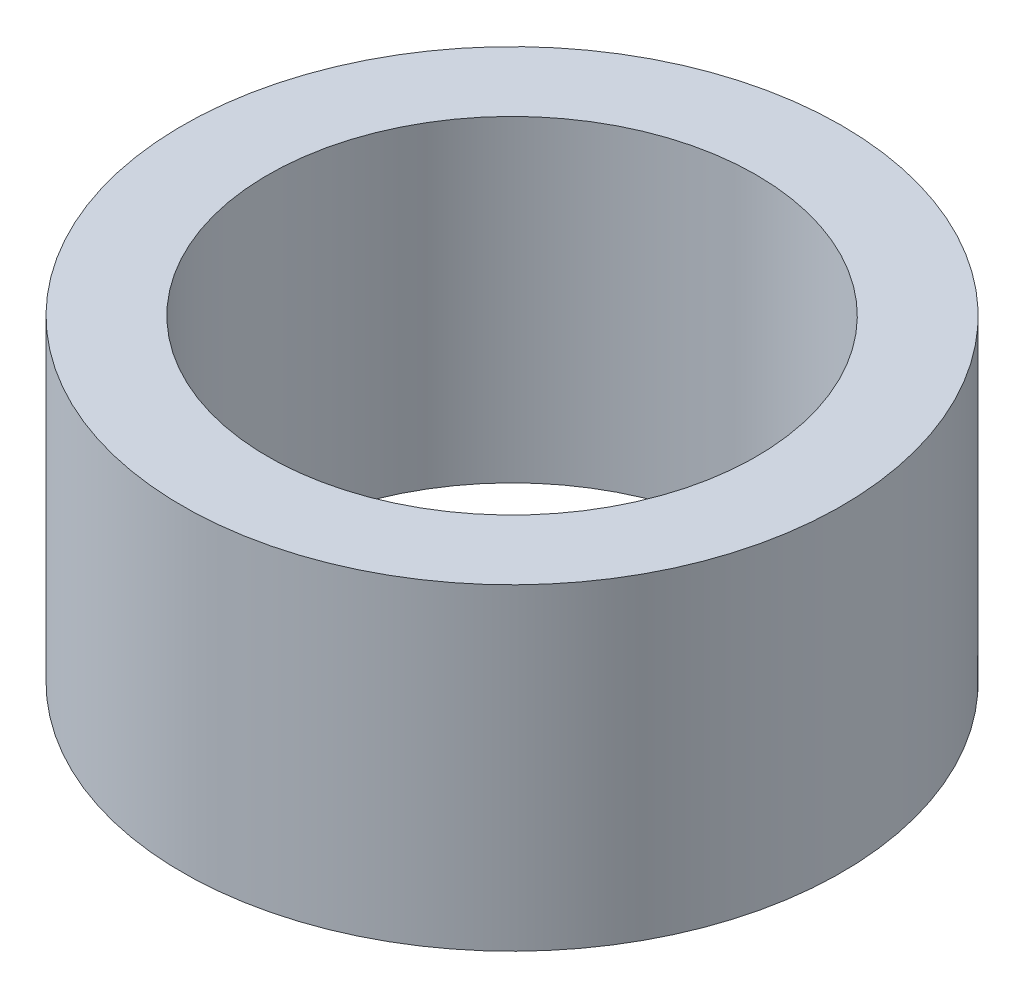
ISO-10303-21;
HEADER;
FILE_DESCRIPTION(('STEP AP214'),'2;1');
FILE_NAME('part.step','',(''),(''),'','','');
FILE_SCHEMA(('AUTOMOTIVE_DESIGN { 1 0 10303 214 1 1 1 1 }'));
ENDSEC;
DATA;
#1=APPLICATION_CONTEXT('core data for automotive mechanical design processes');
#2=APPLICATION_PROTOCOL_DEFINITION('international standard','automotive_design',2000,#1);
#3=PRODUCT_CONTEXT('',#1,'mechanical');
#4=PRODUCT('Part','Part','',(#3));
#5=PRODUCT_RELATED_PRODUCT_CATEGORY('part','',(#4));
#6=PRODUCT_DEFINITION_FORMATION('','',#4);
#7=PRODUCT_DEFINITION_CONTEXT('part definition',#1,'design');
#8=PRODUCT_DEFINITION('design','',#6,#7);
#9=PRODUCT_DEFINITION_SHAPE('','',#8);
#10=(LENGTH_UNIT() NAMED_UNIT(*) SI_UNIT(.MILLI.,.METRE.));
#11=(NAMED_UNIT(*) PLANE_ANGLE_UNIT() SI_UNIT($,.RADIAN.));
#12=(NAMED_UNIT(*) SI_UNIT($,.STERADIAN.) SOLID_ANGLE_UNIT());
#13=UNCERTAINTY_MEASURE_WITH_UNIT(LENGTH_MEASURE(1.E-05),#10,'distance_accuracy_value','');
#14=(GEOMETRIC_REPRESENTATION_CONTEXT(3) GLOBAL_UNCERTAINTY_ASSIGNED_CONTEXT((#13)) GLOBAL_UNIT_ASSIGNED_CONTEXT((#10,
#11,#12)) REPRESENTATION_CONTEXT('',''));
#15=CARTESIAN_POINT('',(0.,0.,0.));
#16=DIRECTION('',(0.,0.,1.));
#17=DIRECTION('',(1.,0.,0.));
#18=AXIS2_PLACEMENT_3D('',#15,#16,#17);
#19=CARTESIAN_POINT('',(0.,6.5,0.));
#20=DIRECTION('',(0.,1.,0.));
#21=DIRECTION('',(0.,0.,1.));
#22=AXIS2_PLACEMENT_3D('',#19,#20,#21);
#23=PLANE('',#22);
#24=CARTESIAN_POINT('',(0.,6.5,0.));
#25=DIRECTION('',(0.,1.,0.));
#26=DIRECTION('',(0.,0.,1.));
#27=AXIS2_PLACEMENT_3D('',#24,#25,#26);
#28=CIRCLE('',#27,6.75);
#29=CARTESIAN_POINT('',(0.,6.5,-6.75));
#30=VERTEX_POINT('',#29);
#31=EDGE_CURVE('E10',#30,#30,#28,.T.);
#32=ORIENTED_EDGE('',*,*,#31,.T.);
#33=EDGE_LOOP('',(#32));
#34=FACE_BOUND('',#33,.T.);
#35=CARTESIAN_POINT('',(0.,6.5,0.));
#36=DIRECTION('',(0.,1.,0.));
#37=DIRECTION('',(0.,0.,1.));
#38=AXIS2_PLACEMENT_3D('',#35,#36,#37);
#39=CIRCLE('',#38,5.);
#40=CARTESIAN_POINT('',(0.,6.5,-5.));
#41=VERTEX_POINT('',#40);
#42=EDGE_CURVE('E46',#41,#41,#39,.T.);
#43=ORIENTED_EDGE('',*,*,#42,.F.);
#44=EDGE_LOOP('',(#43));
#45=FACE_BOUND('',#44,.T.);
#46=ADVANCED_FACE('F35',(#34,#45),#23,.T.);
#47=CARTESIAN_POINT('',(0.,0.,0.));
#48=DIRECTION('',(0.,1.,0.));
#49=DIRECTION('',(0.,0.,1.));
#50=AXIS2_PLACEMENT_3D('',#47,#48,#49);
#51=PLANE('',#50);
#52=CARTESIAN_POINT('',(0.,0.,0.));
#53=DIRECTION('',(0.,1.,0.));
#54=DIRECTION('',(0.,0.,1.));
#55=AXIS2_PLACEMENT_3D('',#52,#53,#54);
#56=CIRCLE('',#55,6.75);
#57=CARTESIAN_POINT('',(0.,0.,-6.75));
#58=VERTEX_POINT('',#57);
#59=EDGE_CURVE('E39',#58,#58,#56,.T.);
#60=ORIENTED_EDGE('',*,*,#59,.F.);
#61=EDGE_LOOP('',(#60));
#62=FACE_BOUND('',#61,.T.);
#63=CARTESIAN_POINT('',(0.,0.,0.));
#64=DIRECTION('',(0.,1.,0.));
#65=DIRECTION('',(0.,0.,1.));
#66=AXIS2_PLACEMENT_3D('',#63,#64,#65);
#67=CIRCLE('',#66,5.);
#68=CARTESIAN_POINT('',(0.,0.,-5.));
#69=VERTEX_POINT('',#68);
#70=EDGE_CURVE('E48',#69,#69,#67,.T.);
#71=ORIENTED_EDGE('',*,*,#70,.T.);
#72=EDGE_LOOP('',(#71));
#73=FACE_BOUND('',#72,.T.);
#74=ADVANCED_FACE('F58',(#62,#73),#51,.F.);
#75=CARTESIAN_POINT('',(0.,6.5,0.));
#76=DIRECTION('',(0.,-1.,0.));
#77=DIRECTION('',(0.,0.,-1.));
#78=AXIS2_PLACEMENT_3D('',#75,#76,#77);
#79=CYLINDRICAL_SURFACE('',#78,6.75);
#80=CARTESIAN_POINT('',(0.,6.5,-6.75));
#81=CARTESIAN_POINT('',(0.,6.43229166666667,-6.75));
#82=CARTESIAN_POINT('',(0.,6.36458333333333,-6.75));
#83=CARTESIAN_POINT('',(0.,6.22916666666667,-6.75));
#84=CARTESIAN_POINT('',(0.,6.16145833333333,-6.75));
#85=CARTESIAN_POINT('',(0.,6.02604166666667,-6.75));
#86=CARTESIAN_POINT('',(0.,5.95833333333333,-6.75));
#87=CARTESIAN_POINT('',(0.,5.82291666666667,-6.75));
#88=CARTESIAN_POINT('',(0.,5.75520833333333,-6.75));
#89=CARTESIAN_POINT('',(0.,5.61979166666667,-6.75));
#90=CARTESIAN_POINT('',(0.,5.55208333333333,-6.75));
#91=CARTESIAN_POINT('',(0.,5.41666666666667,-6.75));
#92=CARTESIAN_POINT('',(0.,5.34895833333333,-6.75));
#93=CARTESIAN_POINT('',(0.,5.21354166666667,-6.75));
#94=CARTESIAN_POINT('',(0.,5.14583333333333,-6.75));
#95=CARTESIAN_POINT('',(0.,5.01041666666667,-6.75));
#96=CARTESIAN_POINT('',(0.,4.94270833333333,-6.75));
#97=CARTESIAN_POINT('',(0.,4.80729166666667,-6.75));
#98=CARTESIAN_POINT('',(0.,4.73958333333333,-6.75));
#99=CARTESIAN_POINT('',(0.,4.60416666666667,-6.75));
#100=CARTESIAN_POINT('',(0.,4.53645833333333,-6.75));
#101=CARTESIAN_POINT('',(0.,4.40104166666667,-6.75));
#102=CARTESIAN_POINT('',(0.,4.33333333333333,-6.75));
#103=CARTESIAN_POINT('',(0.,4.19791666666667,-6.75));
#104=CARTESIAN_POINT('',(0.,4.13020833333333,-6.75));
#105=CARTESIAN_POINT('',(0.,3.99479166666667,-6.75));
#106=CARTESIAN_POINT('',(0.,3.92708333333333,-6.75));
#107=CARTESIAN_POINT('',(0.,3.79166666666667,-6.75));
#108=CARTESIAN_POINT('',(0.,3.72395833333333,-6.75));
#109=CARTESIAN_POINT('',(0.,3.58854166666667,-6.75));
#110=CARTESIAN_POINT('',(0.,3.52083333333333,-6.75));
#111=CARTESIAN_POINT('',(0.,3.38541666666667,-6.75));
#112=CARTESIAN_POINT('',(0.,3.31770833333333,-6.75));
#113=CARTESIAN_POINT('',(0.,3.18229166666667,-6.75));
#114=CARTESIAN_POINT('',(0.,3.11458333333333,-6.75));
#115=CARTESIAN_POINT('',(0.,2.97916666666667,-6.75));
#116=CARTESIAN_POINT('',(0.,2.91145833333333,-6.75));
#117=CARTESIAN_POINT('',(0.,2.77604166666667,-6.75));
#118=CARTESIAN_POINT('',(0.,2.70833333333333,-6.75));
#119=CARTESIAN_POINT('',(0.,2.57291666666667,-6.75));
#120=CARTESIAN_POINT('',(0.,2.50520833333333,-6.75));
#121=CARTESIAN_POINT('',(0.,2.36979166666667,-6.75));
#122=CARTESIAN_POINT('',(0.,2.30208333333333,-6.75));
#123=CARTESIAN_POINT('',(0.,2.16666666666667,-6.75));
#124=CARTESIAN_POINT('',(0.,2.09895833333333,-6.75));
#125=CARTESIAN_POINT('',(0.,1.96354166666667,-6.75));
#126=CARTESIAN_POINT('',(0.,1.89583333333333,-6.75));
#127=CARTESIAN_POINT('',(0.,1.76041666666667,-6.75));
#128=CARTESIAN_POINT('',(0.,1.69270833333333,-6.75));
#129=CARTESIAN_POINT('',(0.,1.55729166666667,-6.75));
#130=CARTESIAN_POINT('',(0.,1.48958333333333,-6.75));
#131=CARTESIAN_POINT('',(0.,1.35416666666667,-6.75));
#132=CARTESIAN_POINT('',(0.,1.28645833333333,-6.75));
#133=CARTESIAN_POINT('',(0.,1.15104166666667,-6.75));
#134=CARTESIAN_POINT('',(0.,1.08333333333333,-6.75));
#135=CARTESIAN_POINT('',(0.,0.947916666666667,-6.75));
#136=CARTESIAN_POINT('',(0.,0.880208333333333,-6.75));
#137=CARTESIAN_POINT('',(0.,0.744791666666667,-6.75));
#138=CARTESIAN_POINT('',(0.,0.677083333333333,-6.75));
#139=CARTESIAN_POINT('',(0.,0.541666666666667,-6.75));
#140=CARTESIAN_POINT('',(0.,0.473958333333333,-6.75));
#141=CARTESIAN_POINT('',(0.,0.338541666666667,-6.75));
#142=CARTESIAN_POINT('',(0.,0.270833333333334,-6.75));
#143=CARTESIAN_POINT('',(0.,0.135416666666667,-6.75));
#144=CARTESIAN_POINT('',(0.,0.0677083333333334,-6.75));
#145=CARTESIAN_POINT('',(0.,0.,-6.75));
#146=B_SPLINE_CURVE_WITH_KNOTS('',3,(#80,#81,#82,#83,#84,#85,#86,#87,#88,#89,#90,#91,#92,#93,
#94,#95,#96,#97,#98,#99,#100,#101,#102,#103,#104,#105,#106,#107,#108,#109,#110,#111,#112,#113,
#114,#115,#116,#117,#118,#119,#120,#121,#122,#123,#124,#125,#126,#127,#128,#129,#130,#131,#132,
#133,#134,#135,#136,#137,#138,#139,#140,#141,#142,#143,#144,#145),.UNSPECIFIED.,.F.,.F.,(4,2,2,
2,2,2,2,2,2,2,2,2,2,2,2,2,2,2,2,2,2,2,2,2,2,2,2,2,2,2,2,2,4),(0.,0.203124999999999,0.40625,
0.609375,0.812499999999999,1.015625,1.21875,1.421875,1.625,1.828125,2.03125,2.234375,2.4375,
2.640625,2.84375,3.046875,3.25,3.453125,3.65625,3.859375,4.0625,4.265625,4.46875,4.671875,4.875,
5.078125,5.28125,5.484375,5.6875,5.890625,6.09375,6.296875,6.5),.UNSPECIFIED.);
#147=EDGE_CURVE('BSEAM37',#30,#58,#146,.T.);
#148=ORIENTED_EDGE('',*,*,#31,.F.);
#149=ORIENTED_EDGE('',*,*,#59,.T.);
#150=ORIENTED_EDGE('',*,*,#147,.T.);
#151=ORIENTED_EDGE('',*,*,#147,.F.);
#152=EDGE_LOOP('',(#148,#150,#149,#151));
#153=FACE_BOUND('',#152,.T.);
#154=ADVANCED_FACE('F37',(#153),#79,.T.);
#155=CARTESIAN_POINT('',(0.,6.5,0.));
#156=DIRECTION('',(0.,-1.,0.));
#157=DIRECTION('',(0.,0.,-1.));
#158=AXIS2_PLACEMENT_3D('',#155,#156,#157);
#159=CYLINDRICAL_SURFACE('',#158,5.);
#160=CARTESIAN_POINT('',(0.,6.5,-5.));
#161=CARTESIAN_POINT('',(0.,6.43229166666667,-5.));
#162=CARTESIAN_POINT('',(0.,6.36458333333333,-5.));
#163=CARTESIAN_POINT('',(0.,6.22916666666667,-5.));
#164=CARTESIAN_POINT('',(0.,6.16145833333333,-5.));
#165=CARTESIAN_POINT('',(0.,6.02604166666667,-5.));
#166=CARTESIAN_POINT('',(0.,5.95833333333333,-5.));
#167=CARTESIAN_POINT('',(0.,5.82291666666667,-5.));
#168=CARTESIAN_POINT('',(0.,5.75520833333333,-5.));
#169=CARTESIAN_POINT('',(0.,5.61979166666667,-5.));
#170=CARTESIAN_POINT('',(0.,5.55208333333333,-5.));
#171=CARTESIAN_POINT('',(0.,5.41666666666667,-5.));
#172=CARTESIAN_POINT('',(0.,5.34895833333333,-5.));
#173=CARTESIAN_POINT('',(0.,5.21354166666667,-5.));
#174=CARTESIAN_POINT('',(0.,5.14583333333333,-5.));
#175=CARTESIAN_POINT('',(0.,5.01041666666667,-5.));
#176=CARTESIAN_POINT('',(0.,4.94270833333333,-5.));
#177=CARTESIAN_POINT('',(0.,4.80729166666667,-5.));
#178=CARTESIAN_POINT('',(0.,4.73958333333333,-5.));
#179=CARTESIAN_POINT('',(0.,4.60416666666667,-5.));
#180=CARTESIAN_POINT('',(0.,4.53645833333333,-5.));
#181=CARTESIAN_POINT('',(0.,4.40104166666667,-5.));
#182=CARTESIAN_POINT('',(0.,4.33333333333333,-5.));
#183=CARTESIAN_POINT('',(0.,4.19791666666667,-5.));
#184=CARTESIAN_POINT('',(0.,4.13020833333333,-5.));
#185=CARTESIAN_POINT('',(0.,3.99479166666667,-5.));
#186=CARTESIAN_POINT('',(0.,3.92708333333333,-5.));
#187=CARTESIAN_POINT('',(0.,3.79166666666667,-5.));
#188=CARTESIAN_POINT('',(0.,3.72395833333333,-5.));
#189=CARTESIAN_POINT('',(0.,3.58854166666667,-5.));
#190=CARTESIAN_POINT('',(0.,3.52083333333333,-5.));
#191=CARTESIAN_POINT('',(0.,3.38541666666667,-5.));
#192=CARTESIAN_POINT('',(0.,3.31770833333333,-5.));
#193=CARTESIAN_POINT('',(0.,3.18229166666667,-5.));
#194=CARTESIAN_POINT('',(0.,3.11458333333333,-5.));
#195=CARTESIAN_POINT('',(0.,2.97916666666667,-5.));
#196=CARTESIAN_POINT('',(0.,2.91145833333333,-5.));
#197=CARTESIAN_POINT('',(0.,2.77604166666667,-5.));
#198=CARTESIAN_POINT('',(0.,2.70833333333333,-5.));
#199=CARTESIAN_POINT('',(0.,2.57291666666667,-5.));
#200=CARTESIAN_POINT('',(0.,2.50520833333333,-5.));
#201=CARTESIAN_POINT('',(0.,2.36979166666667,-5.));
#202=CARTESIAN_POINT('',(0.,2.30208333333333,-5.));
#203=CARTESIAN_POINT('',(0.,2.16666666666667,-5.));
#204=CARTESIAN_POINT('',(0.,2.09895833333333,-5.));
#205=CARTESIAN_POINT('',(0.,1.96354166666667,-5.));
#206=CARTESIAN_POINT('',(0.,1.89583333333333,-5.));
#207=CARTESIAN_POINT('',(0.,1.76041666666667,-5.));
#208=CARTESIAN_POINT('',(0.,1.69270833333333,-5.));
#209=CARTESIAN_POINT('',(0.,1.55729166666667,-5.));
#210=CARTESIAN_POINT('',(0.,1.48958333333333,-5.));
#211=CARTESIAN_POINT('',(0.,1.35416666666667,-5.));
#212=CARTESIAN_POINT('',(0.,1.28645833333333,-5.));
#213=CARTESIAN_POINT('',(0.,1.15104166666667,-5.));
#214=CARTESIAN_POINT('',(0.,1.08333333333333,-5.));
#215=CARTESIAN_POINT('',(0.,0.947916666666667,-5.));
#216=CARTESIAN_POINT('',(0.,0.880208333333333,-5.));
#217=CARTESIAN_POINT('',(0.,0.744791666666667,-5.));
#218=CARTESIAN_POINT('',(0.,0.677083333333333,-5.));
#219=CARTESIAN_POINT('',(0.,0.541666666666667,-5.));
#220=CARTESIAN_POINT('',(0.,0.473958333333333,-5.));
#221=CARTESIAN_POINT('',(0.,0.338541666666667,-5.));
#222=CARTESIAN_POINT('',(0.,0.270833333333334,-5.));
#223=CARTESIAN_POINT('',(0.,0.135416666666667,-5.));
#224=CARTESIAN_POINT('',(0.,0.0677083333333334,-5.));
#225=CARTESIAN_POINT('',(0.,0.,-5.));
#226=B_SPLINE_CURVE_WITH_KNOTS('',3,(#160,#161,#162,#163,#164,#165,#166,#167,#168,#169,#170,
#171,#172,#173,#174,#175,#176,#177,#178,#179,#180,#181,#182,#183,#184,#185,#186,#187,#188,#189,
#190,#191,#192,#193,#194,#195,#196,#197,#198,#199,#200,#201,#202,#203,#204,#205,#206,#207,#208,
#209,#210,#211,#212,#213,#214,#215,#216,#217,#218,#219,#220,#221,#222,#223,#224,#225),
.UNSPECIFIED.,.F.,.F.,(4,2,2,2,2,2,2,2,2,2,2,2,2,2,2,2,2,2,2,2,2,2,2,2,2,2,2,2,2,2,2,2,4),(0.,
0.203125,0.40625,0.609375000000001,0.812500000000001,1.015625,1.21875,1.421875,1.625,1.828125,
2.03125,2.234375,2.4375,2.640625,2.84375,3.046875,3.25,3.453125,3.65625,3.859375,4.0625,
4.265625,4.46875,4.671875,4.875,5.078125,5.28125,5.484375,5.6875,5.890625,6.09375,6.296875,6.5),.UNSPECIFIED.);
#227=EDGE_CURVE('BSEAM54',#41,#69,#226,.T.);
#228=ORIENTED_EDGE('',*,*,#42,.T.);
#229=ORIENTED_EDGE('',*,*,#70,.F.);
#230=ORIENTED_EDGE('',*,*,#227,.T.);
#231=ORIENTED_EDGE('',*,*,#227,.F.);
#232=EDGE_LOOP('',(#228,#230,#229,#231));
#233=FACE_BOUND('',#232,.T.);
#234=ADVANCED_FACE('F54',(#233),#159,.F.);
#235=CLOSED_SHELL('',(#46,#74,#154,#234));
#236=MANIFOLD_SOLID_BREP('B2',#235);
#237=ADVANCED_BREP_SHAPE_REPRESENTATION('',(#18,#236),#14);
#238=SHAPE_DEFINITION_REPRESENTATION(#9,#237);
ENDSEC;
END-ISO-10303-21;
